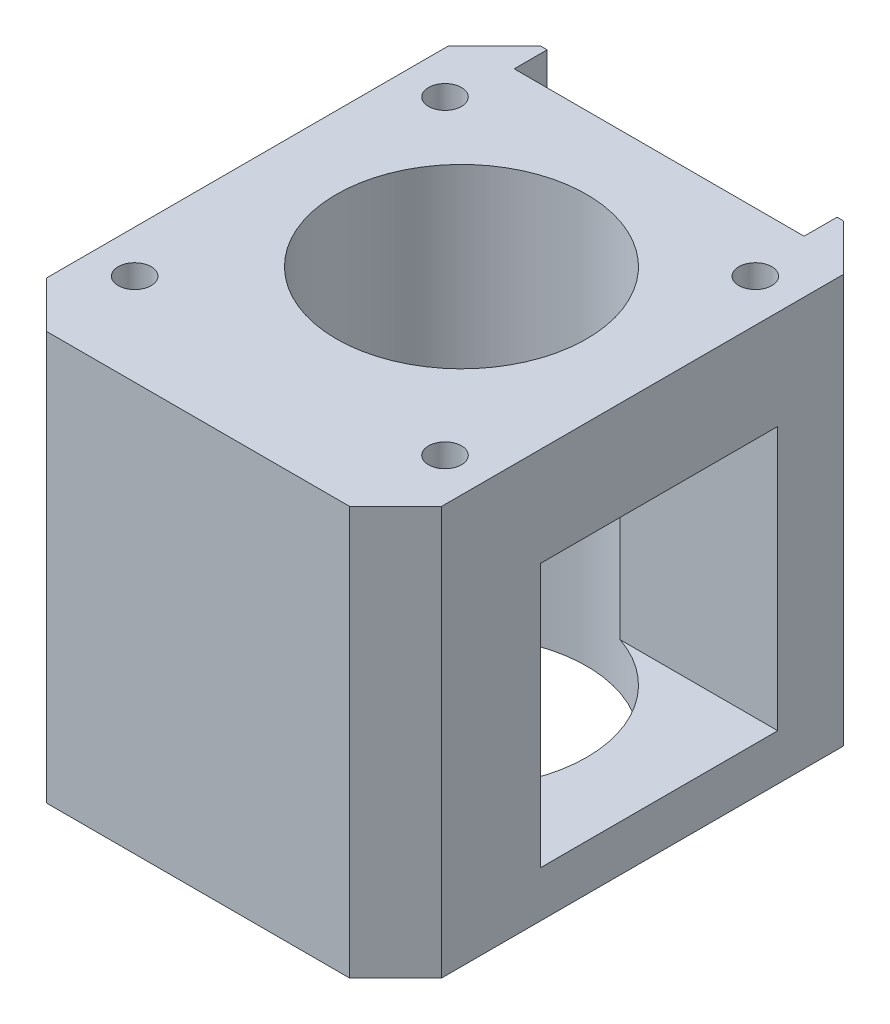
ISO-10303-21;
HEADER;
FILE_DESCRIPTION(('STEP AP214'),'2;1');
FILE_NAME('part.step','',(''),(''),'','','');
FILE_SCHEMA(('AUTOMOTIVE_DESIGN { 1 0 10303 214 1 1 1 1 }'));
ENDSEC;
DATA;
#1=APPLICATION_CONTEXT('core data for automotive mechanical design processes');
#2=APPLICATION_PROTOCOL_DEFINITION('international standard','automotive_design',2000,#1);
#3=PRODUCT_CONTEXT('',#1,'mechanical');
#4=PRODUCT('Part','Part','',(#3));
#5=PRODUCT_RELATED_PRODUCT_CATEGORY('part','',(#4));
#6=PRODUCT_DEFINITION_FORMATION('','',#4);
#7=PRODUCT_DEFINITION_CONTEXT('part definition',#1,'design');
#8=PRODUCT_DEFINITION('design','',#6,#7);
#9=PRODUCT_DEFINITION_SHAPE('','',#8);
#10=(LENGTH_UNIT() NAMED_UNIT(*) SI_UNIT(.MILLI.,.METRE.));
#11=(NAMED_UNIT(*) PLANE_ANGLE_UNIT() SI_UNIT($,.RADIAN.));
#12=(NAMED_UNIT(*) SI_UNIT($,.STERADIAN.) SOLID_ANGLE_UNIT());
#13=UNCERTAINTY_MEASURE_WITH_UNIT(LENGTH_MEASURE(1.E-05),#10,'distance_accuracy_value','');
#14=(GEOMETRIC_REPRESENTATION_CONTEXT(3) GLOBAL_UNCERTAINTY_ASSIGNED_CONTEXT((#13)) GLOBAL_UNIT_ASSIGNED_CONTEXT((#10,
#11,#12)) REPRESENTATION_CONTEXT('',''));
#15=CARTESIAN_POINT('',(0.,0.,0.));
#16=DIRECTION('',(0.,0.,1.));
#17=DIRECTION('',(1.,0.,0.));
#18=AXIS2_PLACEMENT_3D('',#15,#16,#17);
#19=CARTESIAN_POINT('',(-30.,62.,-37.5));
#20=DIRECTION('',(0.,0.,1.));
#21=DIRECTION('',(1.,0.,0.));
#22=AXIS2_PLACEMENT_3D('',#19,#20,#21);
#23=PLANE('',#22);
#24=DIRECTION('',(-1.,0.,0.));
#25=VECTOR('',#24,1.);
#26=CARTESIAN_POINT('',(-30.,0.,-37.5));
#27=LINE('',#26,#25);
#28=CARTESIAN_POINT('',(-22.,0.,-37.5));
#29=VERTEX_POINT('',#28);
#30=CARTESIAN_POINT('',(-23.,0.,-37.5));
#31=VERTEX_POINT('',#30);
#32=EDGE_CURVE('E228',#29,#31,#27,.T.);
#33=ORIENTED_EDGE('',*,*,#32,.T.);
#34=DIRECTION('',(0.,1.,0.));
#35=VECTOR('',#34,1.);
#36=CARTESIAN_POINT('',(-23.,62.,-37.5));
#37=LINE('',#36,#35);
#38=CARTESIAN_POINT('',(-23.,62.,-37.5));
#39=VERTEX_POINT('',#38);
#40=EDGE_CURVE('E260',#31,#39,#37,.T.);
#41=ORIENTED_EDGE('',*,*,#40,.T.);
#42=DIRECTION('',(-1.,0.,0.));
#43=VECTOR('',#42,1.);
#44=CARTESIAN_POINT('',(-30.,62.,-37.5));
#45=LINE('',#44,#43);
#46=CARTESIAN_POINT('',(-22.,62.,-37.5));
#47=VERTEX_POINT('',#46);
#48=EDGE_CURVE('E216',#47,#39,#45,.T.);
#49=ORIENTED_EDGE('',*,*,#48,.F.);
#50=DIRECTION('',(0.,1.,0.));
#51=VECTOR('',#50,1.);
#52=CARTESIAN_POINT('',(-22.,-53.7401153701776,-37.5));
#53=LINE('',#52,#51);
#54=EDGE_CURVE('E193',#29,#47,#53,.T.);
#55=ORIENTED_EDGE('',*,*,#54,.F.);
#56=EDGE_LOOP('',(#33,#41,#49,#55));
#57=FACE_BOUND('',#56,.T.);
#58=ADVANCED_FACE('F35',(#57),#23,.F.);
#59=CARTESIAN_POINT('',(30.,62.,-37.5));
#60=DIRECTION('',(-1.,0.,0.));
#61=DIRECTION('',(0.,0.,1.));
#62=AXIS2_PLACEMENT_3D('',#59,#60,#61);
#63=PLANE('',#62);
#64=DIRECTION('',(0.,0.,-1.));
#65=VECTOR('',#64,1.);
#66=CARTESIAN_POINT('',(30.,7.,15.5));
#67=LINE('',#66,#65);
#68=CARTESIAN_POINT('',(30.,7.,15.5));
#69=VERTEX_POINT('',#68);
#70=CARTESIAN_POINT('',(30.,7.,-20.5));
#71=VERTEX_POINT('',#70);
#72=EDGE_CURVE('E155',#69,#71,#67,.T.);
#73=ORIENTED_EDGE('',*,*,#72,.F.);
#74=DIRECTION('',(0.,-1.,0.));
#75=VECTOR('',#74,1.);
#76=CARTESIAN_POINT('',(30.,47.,15.5));
#77=LINE('',#76,#75);
#78=CARTESIAN_POINT('',(30.,47.,15.5));
#79=VERTEX_POINT('',#78);
#80=EDGE_CURVE('E483',#79,#69,#77,.T.);
#81=ORIENTED_EDGE('',*,*,#80,.F.);
#82=DIRECTION('',(0.,0.,1.));
#83=VECTOR('',#82,1.);
#84=CARTESIAN_POINT('',(30.,47.,15.5));
#85=LINE('',#84,#83);
#86=CARTESIAN_POINT('',(30.,47.,-20.5));
#87=VERTEX_POINT('',#86);
#88=EDGE_CURVE('E175',#87,#79,#85,.T.);
#89=ORIENTED_EDGE('',*,*,#88,.F.);
#90=DIRECTION('',(0.,1.,0.));
#91=VECTOR('',#90,1.);
#92=CARTESIAN_POINT('',(30.,47.,-20.5));
#93=LINE('',#92,#91);
#94=EDGE_CURVE('E179',#71,#87,#93,.T.);
#95=ORIENTED_EDGE('',*,*,#94,.F.);
#96=EDGE_LOOP('',(#73,#81,#89,#95));
#97=FACE_BOUND('',#96,.T.);
#98=DIRECTION('',(0.,0.,-1.));
#99=VECTOR('',#98,1.);
#100=CARTESIAN_POINT('',(30.,0.,-37.5));
#101=LINE('',#100,#99);
#102=CARTESIAN_POINT('',(30.,0.,30.5));
#103=VERTEX_POINT('',#102);
#104=CARTESIAN_POINT('',(30.,0.,-30.5));
#105=VERTEX_POINT('',#104);
#106=EDGE_CURVE('E213',#103,#105,#101,.T.);
#107=ORIENTED_EDGE('',*,*,#106,.T.);
#108=DIRECTION('',(0.,1.,0.));
#109=VECTOR('',#108,1.);
#110=CARTESIAN_POINT('',(30.,62.,-30.5));
#111=LINE('',#110,#109);
#112=CARTESIAN_POINT('',(30.,62.,-30.5));
#113=VERTEX_POINT('',#112);
#114=EDGE_CURVE('E11',#105,#113,#111,.T.);
#115=ORIENTED_EDGE('',*,*,#114,.T.);
#116=DIRECTION('',(0.,0.,-1.));
#117=VECTOR('',#116,1.);
#118=CARTESIAN_POINT('',(30.,62.,-37.5));
#119=LINE('',#118,#117);
#120=CARTESIAN_POINT('',(30.,62.,30.5));
#121=VERTEX_POINT('',#120);
#122=EDGE_CURVE('E214',#121,#113,#119,.T.);
#123=ORIENTED_EDGE('',*,*,#122,.F.);
#124=DIRECTION('',(0.,-1.,0.));
#125=VECTOR('',#124,1.);
#126=CARTESIAN_POINT('',(30.,62.,30.5));
#127=LINE('',#126,#125);
#128=EDGE_CURVE('E43',#121,#103,#127,.T.);
#129=ORIENTED_EDGE('',*,*,#128,.T.);
#130=EDGE_LOOP('',(#107,#115,#123,#129));
#131=FACE_BOUND('',#130,.T.);
#132=ADVANCED_FACE('F267',(#97,#131),#63,.F.);
#133=CARTESIAN_POINT('',(23.,62.,-37.5));
#134=VERTEX_POINT('',#133);
#135=CARTESIAN_POINT('',(22.,62.,-37.5));
#136=VERTEX_POINT('',#135);
#137=EDGE_CURVE('E218',#134,#136,#45,.T.);
#138=ORIENTED_EDGE('',*,*,#137,.F.);
#139=DIRECTION('',(0.,-1.,0.));
#140=VECTOR('',#139,1.);
#141=CARTESIAN_POINT('',(23.,62.,-37.5));
#142=LINE('',#141,#140);
#143=CARTESIAN_POINT('',(23.,0.,-37.5));
#144=VERTEX_POINT('',#143);
#145=EDGE_CURVE('E262',#134,#144,#142,.T.);
#146=ORIENTED_EDGE('',*,*,#145,.T.);
#147=CARTESIAN_POINT('',(22.,0.,-37.5));
#148=VERTEX_POINT('',#147);
#149=EDGE_CURVE('E229',#144,#148,#27,.T.);
#150=ORIENTED_EDGE('',*,*,#149,.T.);
#151=DIRECTION('',(0.,1.,0.));
#152=VECTOR('',#151,1.);
#153=CARTESIAN_POINT('',(22.,-53.7401153701776,-37.5));
#154=LINE('',#153,#152);
#155=EDGE_CURVE('E206',#148,#136,#154,.T.);
#156=ORIENTED_EDGE('',*,*,#155,.T.);
#157=EDGE_LOOP('',(#138,#146,#150,#156));
#158=FACE_BOUND('',#157,.T.);
#159=ADVANCED_FACE('F279',(#158),#23,.F.);
#160=CARTESIAN_POINT('',(-30.,62.,-37.5));
#161=DIRECTION('',(1.,0.,0.));
#162=DIRECTION('',(0.,0.,-1.));
#163=AXIS2_PLACEMENT_3D('',#160,#161,#162);
#164=PLANE('',#163);
#165=DIRECTION('',(0.,0.,1.));
#166=VECTOR('',#165,1.);
#167=CARTESIAN_POINT('',(-30.,0.,-37.5));
#168=LINE('',#167,#166);
#169=CARTESIAN_POINT('',(-30.,0.,-30.5));
#170=VERTEX_POINT('',#169);
#171=CARTESIAN_POINT('',(-30.,0.,30.5));
#172=VERTEX_POINT('',#171);
#173=EDGE_CURVE('E231',#170,#172,#168,.T.);
#174=ORIENTED_EDGE('',*,*,#173,.T.);
#175=DIRECTION('',(0.,1.,0.));
#176=VECTOR('',#175,1.);
#177=CARTESIAN_POINT('',(-30.,62.,30.5));
#178=LINE('',#177,#176);
#179=CARTESIAN_POINT('',(-30.,62.,30.4999999999999));
#180=VERTEX_POINT('',#179);
#181=EDGE_CURVE('E251',#172,#180,#178,.T.);
#182=ORIENTED_EDGE('',*,*,#181,.T.);
#183=DIRECTION('',(0.,0.,1.));
#184=VECTOR('',#183,1.);
#185=CARTESIAN_POINT('',(-30.,62.,-37.5));
#186=LINE('',#185,#184);
#187=CARTESIAN_POINT('',(-30.,62.,-30.5));
#188=VERTEX_POINT('',#187);
#189=EDGE_CURVE('E220',#188,#180,#186,.T.);
#190=ORIENTED_EDGE('',*,*,#189,.F.);
#191=DIRECTION('',(0.,-1.,0.));
#192=VECTOR('',#191,1.);
#193=CARTESIAN_POINT('',(-30.,62.,-30.5));
#194=LINE('',#193,#192);
#195=EDGE_CURVE('E248',#188,#170,#194,.T.);
#196=ORIENTED_EDGE('',*,*,#195,.T.);
#197=EDGE_LOOP('',(#174,#182,#190,#196));
#198=FACE_BOUND('',#197,.T.);
#199=ADVANCED_FACE('F306',(#198),#164,.F.);
#200=CARTESIAN_POINT('',(-30.,62.,37.5));
#201=DIRECTION('',(0.,0.,-1.));
#202=DIRECTION('',(-1.,0.,0.));
#203=AXIS2_PLACEMENT_3D('',#200,#201,#202);
#204=PLANE('',#203);
#205=DIRECTION('',(1.,0.,0.));
#206=VECTOR('',#205,1.);
#207=CARTESIAN_POINT('',(-30.,62.,37.5));
#208=LINE('',#207,#206);
#209=CARTESIAN_POINT('',(-23.,62.,37.5));
#210=VERTEX_POINT('',#209);
#211=CARTESIAN_POINT('',(23.,62.,37.5));
#212=VERTEX_POINT('',#211);
#213=EDGE_CURVE('E223',#210,#212,#208,.T.);
#214=ORIENTED_EDGE('',*,*,#213,.F.);
#215=DIRECTION('',(0.,-1.,0.));
#216=VECTOR('',#215,1.);
#217=CARTESIAN_POINT('',(-23.,62.,37.5));
#218=LINE('',#217,#216);
#219=CARTESIAN_POINT('',(-23.,0.,37.5));
#220=VERTEX_POINT('',#219);
#221=EDGE_CURVE('E237',#210,#220,#218,.T.);
#222=ORIENTED_EDGE('',*,*,#221,.T.);
#223=DIRECTION('',(1.,0.,0.));
#224=VECTOR('',#223,1.);
#225=CARTESIAN_POINT('',(-30.,0.,37.5));
#226=LINE('',#225,#224);
#227=CARTESIAN_POINT('',(23.,0.,37.5));
#228=VERTEX_POINT('',#227);
#229=EDGE_CURVE('E217',#220,#228,#226,.T.);
#230=ORIENTED_EDGE('',*,*,#229,.T.);
#231=DIRECTION('',(0.,1.,0.));
#232=VECTOR('',#231,1.);
#233=CARTESIAN_POINT('',(23.,62.,37.5));
#234=LINE('',#233,#232);
#235=EDGE_CURVE('E226',#228,#212,#234,.T.);
#236=ORIENTED_EDGE('',*,*,#235,.T.);
#237=EDGE_LOOP('',(#214,#222,#230,#236));
#238=FACE_BOUND('',#237,.T.);
#239=ADVANCED_FACE('F314',(#238),#204,.F.);
#240=CARTESIAN_POINT('',(0.,62.,0.));
#241=DIRECTION('',(0.,1.,0.));
#242=DIRECTION('',(0.,0.,1.));
#243=AXIS2_PLACEMENT_3D('',#240,#241,#242);
#244=PLANE('',#243);
#245=CARTESIAN_POINT('',(-23.5499999999987,62.,23.55));
#246=DIRECTION('',(0.,1.,0.));
#247=DIRECTION('',(0.,0.,1.));
#248=AXIS2_PLACEMENT_3D('',#245,#246,#247);
#249=CIRCLE('',#248,2.5000000000007);
#250=CARTESIAN_POINT('',(-23.5499999999987,62.,26.0500000000007));
#251=VERTEX_POINT('',#250);
#252=EDGE_CURVE('E434',#251,#251,#249,.T.);
#253=ORIENTED_EDGE('',*,*,#252,.F.);
#254=EDGE_LOOP('',(#253));
#255=FACE_BOUND('',#254,.T.);
#256=CARTESIAN_POINT('',(23.5500000000013,62.,23.5499999999987));
#257=DIRECTION('',(0.,1.,0.));
#258=DIRECTION('',(0.,0.,1.));
#259=AXIS2_PLACEMENT_3D('',#256,#257,#258);
#260=CIRCLE('',#259,2.50000000000187);
#261=CARTESIAN_POINT('',(23.5500000000013,62.,26.0500000000005));
#262=VERTEX_POINT('',#261);
#263=EDGE_CURVE('E433',#262,#262,#260,.T.);
#264=ORIENTED_EDGE('',*,*,#263,.F.);
#265=EDGE_LOOP('',(#264));
#266=FACE_BOUND('',#265,.T.);
#267=CARTESIAN_POINT('',(23.55,62.,-23.5500000000013));
#268=DIRECTION('',(0.,1.,0.));
#269=DIRECTION('',(0.,0.,1.));
#270=AXIS2_PLACEMENT_3D('',#267,#268,#269);
#271=CIRCLE('',#270,2.50000000000137);
#272=CARTESIAN_POINT('',(23.55,62.,-21.05));
#273=VERTEX_POINT('',#272);
#274=EDGE_CURVE('E443',#273,#273,#271,.T.);
#275=ORIENTED_EDGE('',*,*,#274,.F.);
#276=EDGE_LOOP('',(#275));
#277=FACE_BOUND('',#276,.T.);
#278=CARTESIAN_POINT('',(-23.55,62.,-23.55));
#279=DIRECTION('',(0.,1.,0.));
#280=DIRECTION('',(0.,0.,1.));
#281=AXIS2_PLACEMENT_3D('',#278,#279,#280);
#282=CIRCLE('',#281,2.5);
#283=CARTESIAN_POINT('',(-23.55,62.,-21.05));
#284=VERTEX_POINT('',#283);
#285=EDGE_CURVE('E448',#284,#284,#282,.T.);
#286=ORIENTED_EDGE('',*,*,#285,.F.);
#287=EDGE_LOOP('',(#286));
#288=FACE_BOUND('',#287,.T.);
#289=CARTESIAN_POINT('',(0.,62.,-2.5));
#290=DIRECTION('',(0.,1.,0.));
#291=DIRECTION('',(0.,0.,1.));
#292=AXIS2_PLACEMENT_3D('',#289,#290,#291);
#293=CIRCLE('',#292,19.);
#294=CARTESIAN_POINT('',(0.,62.,16.5));
#295=VERTEX_POINT('',#294);
#296=EDGE_CURVE('E168',#295,#295,#293,.T.);
#297=ORIENTED_EDGE('',*,*,#296,.F.);
#298=EDGE_LOOP('',(#297));
#299=FACE_BOUND('',#298,.T.);
#300=ORIENTED_EDGE('',*,*,#189,.T.);
#301=DIRECTION('',(-0.707106781186546,0.,-0.707106781186549));
#302=VECTOR('',#301,1.);
#303=CARTESIAN_POINT('',(-30.25,62.,30.2499999999999));
#304=LINE('',#303,#302);
#305=EDGE_CURVE('E258',#180,#210,#304,.F.);
#306=ORIENTED_EDGE('',*,*,#305,.T.);
#307=ORIENTED_EDGE('',*,*,#213,.T.);
#308=DIRECTION('',(-0.707106781186549,0.,0.707106781186546));
#309=VECTOR('',#308,1.);
#310=CARTESIAN_POINT('',(30.25,62.,30.2500000000001));
#311=LINE('',#310,#309);
#312=EDGE_CURVE('E253',#212,#121,#311,.F.);
#313=ORIENTED_EDGE('',*,*,#312,.T.);
#314=ORIENTED_EDGE('',*,*,#122,.T.);
#315=DIRECTION('',(0.707106781186546,0.,0.707106781186549));
#316=VECTOR('',#315,1.);
#317=CARTESIAN_POINT('',(30.25,62.,-30.2499999999999));
#318=LINE('',#317,#316);
#319=EDGE_CURVE('E50',#113,#134,#318,.F.);
#320=ORIENTED_EDGE('',*,*,#319,.T.);
#321=ORIENTED_EDGE('',*,*,#137,.T.);
#322=DIRECTION('',(0.,0.,-1.));
#323=VECTOR('',#322,1.);
#324=CARTESIAN_POINT('',(22.,62.,-37.5));
#325=LINE('',#324,#323);
#326=CARTESIAN_POINT('',(22.,62.,-32.5));
#327=VERTEX_POINT('',#326);
#328=EDGE_CURVE('E201',#327,#136,#325,.T.);
#329=ORIENTED_EDGE('',*,*,#328,.F.);
#330=DIRECTION('',(1.,0.,0.));
#331=VECTOR('',#330,1.);
#332=CARTESIAN_POINT('',(-22.,62.,-32.5));
#333=LINE('',#332,#331);
#334=CARTESIAN_POINT('',(-22.,62.,-32.5));
#335=VERTEX_POINT('',#334);
#336=EDGE_CURVE('E198',#335,#327,#333,.T.);
#337=ORIENTED_EDGE('',*,*,#336,.F.);
#338=DIRECTION('',(0.,0.,1.));
#339=VECTOR('',#338,1.);
#340=CARTESIAN_POINT('',(-22.,62.,-37.5));
#341=LINE('',#340,#339);
#342=EDGE_CURVE('E188',#47,#335,#341,.T.);
#343=ORIENTED_EDGE('',*,*,#342,.F.);
#344=ORIENTED_EDGE('',*,*,#48,.T.);
#345=DIRECTION('',(0.707106781186549,0.,-0.707106781186546));
#346=VECTOR('',#345,1.);
#347=CARTESIAN_POINT('',(-30.25,62.,-30.2500000000001));
#348=LINE('',#347,#346);
#349=EDGE_CURVE('E256',#39,#188,#348,.F.);
#350=ORIENTED_EDGE('',*,*,#349,.T.);
#351=EDGE_LOOP('',(#300,#306,#307,#313,#314,#320,#321,#329,#337,#343,#344,#350));
#352=FACE_BOUND('',#351,.T.);
#353=ADVANCED_FACE('F282',(#255,#266,#277,#288,#299,#352),#244,.T.);
#354=CARTESIAN_POINT('',(0.,0.,0.));
#355=DIRECTION('',(0.,1.,0.));
#356=DIRECTION('',(0.,0.,1.));
#357=AXIS2_PLACEMENT_3D('',#354,#355,#356);
#358=PLANE('',#357);
#359=CARTESIAN_POINT('',(0.,0.,-2.5));
#360=DIRECTION('',(0.,1.,0.));
#361=DIRECTION('',(0.,0.,1.));
#362=AXIS2_PLACEMENT_3D('',#359,#360,#361);
#363=CIRCLE('',#362,19.);
#364=CARTESIAN_POINT('',(0.,0.,16.5));
#365=VERTEX_POINT('',#364);
#366=EDGE_CURVE('E185',#365,#365,#363,.F.);
#367=ORIENTED_EDGE('',*,*,#366,.F.);
#368=EDGE_LOOP('',(#367));
#369=FACE_BOUND('',#368,.T.);
#370=ORIENTED_EDGE('',*,*,#229,.F.);
#371=DIRECTION('',(0.707106781186546,0.,0.707106781186549));
#372=VECTOR('',#371,1.);
#373=CARTESIAN_POINT('',(-23.,0.,37.5));
#374=LINE('',#373,#372);
#375=EDGE_CURVE('E246',#220,#172,#374,.F.);
#376=ORIENTED_EDGE('',*,*,#375,.T.);
#377=ORIENTED_EDGE('',*,*,#173,.F.);
#378=DIRECTION('',(-0.707106781186549,0.,0.707106781186546));
#379=VECTOR('',#378,1.);
#380=CARTESIAN_POINT('',(-30.,0.,-30.5));
#381=LINE('',#380,#379);
#382=EDGE_CURVE('E244',#170,#31,#381,.F.);
#383=ORIENTED_EDGE('',*,*,#382,.T.);
#384=ORIENTED_EDGE('',*,*,#32,.F.);
#385=DIRECTION('',(0.,0.,-1.));
#386=VECTOR('',#385,1.);
#387=CARTESIAN_POINT('',(-22.,0.,-37.5));
#388=LINE('',#387,#386);
#389=CARTESIAN_POINT('',(-22.,0.,-32.5));
#390=VERTEX_POINT('',#389);
#391=EDGE_CURVE('E192',#390,#29,#388,.T.);
#392=ORIENTED_EDGE('',*,*,#391,.F.);
#393=DIRECTION('',(-1.,0.,0.));
#394=VECTOR('',#393,1.);
#395=CARTESIAN_POINT('',(-22.,0.,-32.5));
#396=LINE('',#395,#394);
#397=CARTESIAN_POINT('',(22.,0.,-32.5));
#398=VERTEX_POINT('',#397);
#399=EDGE_CURVE('E195',#398,#390,#396,.T.);
#400=ORIENTED_EDGE('',*,*,#399,.F.);
#401=DIRECTION('',(0.,0.,1.));
#402=VECTOR('',#401,1.);
#403=CARTESIAN_POINT('',(22.,0.,-37.5));
#404=LINE('',#403,#402);
#405=EDGE_CURVE('E189',#148,#398,#404,.T.);
#406=ORIENTED_EDGE('',*,*,#405,.F.);
#407=ORIENTED_EDGE('',*,*,#149,.F.);
#408=DIRECTION('',(-0.707106781186546,0.,-0.707106781186549));
#409=VECTOR('',#408,1.);
#410=CARTESIAN_POINT('',(23.,0.,-37.5));
#411=LINE('',#410,#409);
#412=EDGE_CURVE('E242',#144,#105,#411,.F.);
#413=ORIENTED_EDGE('',*,*,#412,.T.);
#414=ORIENTED_EDGE('',*,*,#106,.F.);
#415=DIRECTION('',(0.707106781186549,0.,-0.707106781186546));
#416=VECTOR('',#415,1.);
#417=CARTESIAN_POINT('',(30.,0.,30.5));
#418=LINE('',#417,#416);
#419=EDGE_CURVE('E240',#103,#228,#418,.F.);
#420=ORIENTED_EDGE('',*,*,#419,.T.);
#421=EDGE_LOOP('',(#370,#376,#377,#383,#384,#392,#400,#406,#407,#413,#414,#420));
#422=FACE_BOUND('',#421,.T.);
#423=ADVANCED_FACE('F272',(#369,#422),#358,.F.);
#424=CARTESIAN_POINT('',(-22.,-53.7401153701776,-37.5));
#425=DIRECTION('',(-1.,0.,0.));
#426=DIRECTION('',(0.,0.,1.));
#427=AXIS2_PLACEMENT_3D('',#424,#425,#426);
#428=PLANE('',#427);
#429=ORIENTED_EDGE('',*,*,#391,.T.);
#430=ORIENTED_EDGE('',*,*,#54,.T.);
#431=ORIENTED_EDGE('',*,*,#342,.T.);
#432=DIRECTION('',(0.,1.,0.));
#433=VECTOR('',#432,1.);
#434=CARTESIAN_POINT('',(-22.,-53.7401153701776,-32.5));
#435=LINE('',#434,#433);
#436=EDGE_CURVE('E204',#390,#335,#435,.T.);
#437=ORIENTED_EDGE('',*,*,#436,.F.);
#438=EDGE_LOOP('',(#429,#430,#431,#437));
#439=FACE_BOUND('',#438,.T.);
#440=ADVANCED_FACE('F344',(#439),#428,.F.);
#441=CARTESIAN_POINT('',(22.,-53.7401153701776,-37.5));
#442=DIRECTION('',(1.,0.,0.));
#443=DIRECTION('',(0.,0.,-1.));
#444=AXIS2_PLACEMENT_3D('',#441,#442,#443);
#445=PLANE('',#444);
#446=ORIENTED_EDGE('',*,*,#405,.T.);
#447=DIRECTION('',(0.,1.,0.));
#448=VECTOR('',#447,1.);
#449=CARTESIAN_POINT('',(22.,-53.7401153701776,-32.5));
#450=LINE('',#449,#448);
#451=EDGE_CURVE('E209',#398,#327,#450,.T.);
#452=ORIENTED_EDGE('',*,*,#451,.T.);
#453=ORIENTED_EDGE('',*,*,#328,.T.);
#454=ORIENTED_EDGE('',*,*,#155,.F.);
#455=EDGE_LOOP('',(#446,#452,#453,#454));
#456=FACE_BOUND('',#455,.T.);
#457=ADVANCED_FACE('F285',(#456),#445,.F.);
#458=CARTESIAN_POINT('',(-22.,-53.7401153701776,-32.5));
#459=DIRECTION('',(0.,0.,1.));
#460=DIRECTION('',(1.,0.,0.));
#461=AXIS2_PLACEMENT_3D('',#458,#459,#460);
#462=PLANE('',#461);
#463=CARTESIAN_POINT('',(-14.0000000000005,9.,-32.5));
#464=DIRECTION('',(0.,0.,-1.));
#465=DIRECTION('',(-1.,0.,0.));
#466=AXIS2_PLACEMENT_3D('',#463,#464,#465);
#467=CIRCLE('',#466,2.5);
#468=CARTESIAN_POINT('',(-16.5000000000005,9.,-32.5));
#469=VERTEX_POINT('',#468);
#470=EDGE_CURVE('E454',#469,#469,#467,.T.);
#471=ORIENTED_EDGE('',*,*,#470,.F.);
#472=EDGE_LOOP('',(#471));
#473=FACE_BOUND('',#472,.T.);
#474=CARTESIAN_POINT('',(13.9999999999995,9.,-32.5));
#475=DIRECTION('',(0.,0.,-1.));
#476=DIRECTION('',(-1.,0.,0.));
#477=AXIS2_PLACEMENT_3D('',#474,#475,#476);
#478=CIRCLE('',#477,2.5);
#479=CARTESIAN_POINT('',(11.4999999999995,9.,-32.5));
#480=VERTEX_POINT('',#479);
#481=EDGE_CURVE('E460',#480,#480,#478,.T.);
#482=ORIENTED_EDGE('',*,*,#481,.F.);
#483=EDGE_LOOP('',(#482));
#484=FACE_BOUND('',#483,.T.);
#485=CARTESIAN_POINT('',(-14.,53.,-32.5));
#486=DIRECTION('',(0.,0.,-1.));
#487=DIRECTION('',(-1.,0.,0.));
#488=AXIS2_PLACEMENT_3D('',#485,#486,#487);
#489=CIRCLE('',#488,2.5);
#490=CARTESIAN_POINT('',(-16.5,53.,-32.5));
#491=VERTEX_POINT('',#490);
#492=EDGE_CURVE('E466',#491,#491,#489,.T.);
#493=ORIENTED_EDGE('',*,*,#492,.F.);
#494=EDGE_LOOP('',(#493));
#495=FACE_BOUND('',#494,.T.);
#496=CARTESIAN_POINT('',(14.,53.,-32.5));
#497=DIRECTION('',(0.,0.,-1.));
#498=DIRECTION('',(-1.,0.,0.));
#499=AXIS2_PLACEMENT_3D('',#496,#497,#498);
#500=CIRCLE('',#499,2.5);
#501=CARTESIAN_POINT('',(11.5,53.,-32.5));
#502=VERTEX_POINT('',#501);
#503=EDGE_CURVE('E472',#502,#502,#500,.T.);
#504=ORIENTED_EDGE('',*,*,#503,.F.);
#505=EDGE_LOOP('',(#504));
#506=FACE_BOUND('',#505,.T.);
#507=ORIENTED_EDGE('',*,*,#399,.T.);
#508=ORIENTED_EDGE('',*,*,#436,.T.);
#509=ORIENTED_EDGE('',*,*,#336,.T.);
#510=ORIENTED_EDGE('',*,*,#451,.F.);
#511=EDGE_LOOP('',(#507,#508,#509,#510));
#512=FACE_BOUND('',#511,.T.);
#513=ADVANCED_FACE('F288',(#473,#484,#495,#506,#512),#462,.F.);
#514=CARTESIAN_POINT('',(0.,-53.7401153701776,-2.5));
#515=DIRECTION('',(0.,1.,0.));
#516=DIRECTION('',(0.,0.,1.));
#517=AXIS2_PLACEMENT_3D('',#514,#515,#516);
#518=CYLINDRICAL_SURFACE('',#517,19.);
#519=CARTESIAN_POINT('',(0.,47.,-2.5));
#520=DIRECTION('',(0.,1.,0.));
#521=DIRECTION('',(0.,0.,1.));
#522=AXIS2_PLACEMENT_3D('',#519,#520,#521);
#523=CIRCLE('',#522,19.);
#524=CARTESIAN_POINT('',(6.08276253029819,47.,15.5));
#525=VERTEX_POINT('',#524);
#526=CARTESIAN_POINT('',(6.08276253029821,47.,-20.5));
#527=VERTEX_POINT('',#526);
#528=EDGE_CURVE('E169',#525,#527,#523,.T.);
#529=ORIENTED_EDGE('',*,*,#528,.F.);
#530=DIRECTION('',(0.,1.,0.));
#531=VECTOR('',#530,1.);
#532=CARTESIAN_POINT('',(6.08276253029823,-53.7401153701776,15.5));
#533=LINE('',#532,#531);
#534=CARTESIAN_POINT('',(6.08276253029822,7.,15.5));
#535=VERTEX_POINT('',#534);
#536=EDGE_CURVE('E174',#535,#525,#533,.T.);
#537=ORIENTED_EDGE('',*,*,#536,.F.);
#538=CARTESIAN_POINT('',(0.,7.,-2.5));
#539=DIRECTION('',(0.,-1.,0.));
#540=DIRECTION('',(0.,0.,-1.));
#541=AXIS2_PLACEMENT_3D('',#538,#539,#540);
#542=CIRCLE('',#541,19.);
#543=CARTESIAN_POINT('',(6.08276253029823,7.,-20.5));
#544=VERTEX_POINT('',#543);
#545=EDGE_CURVE('E152',#544,#535,#542,.T.);
#546=ORIENTED_EDGE('',*,*,#545,.F.);
#547=DIRECTION('',(0.,1.,0.));
#548=VECTOR('',#547,1.);
#549=CARTESIAN_POINT('',(6.08276253029821,-53.7401153701776,-20.5));
#550=LINE('',#549,#548);
#551=EDGE_CURVE('E164',#527,#544,#550,.F.);
#552=ORIENTED_EDGE('',*,*,#551,.F.);
#553=EDGE_LOOP('',(#529,#537,#546,#552));
#554=FACE_BOUND('',#553,.T.);
#555=ORIENTED_EDGE('',*,*,#366,.T.);
#556=EDGE_LOOP('',(#555));
#557=FACE_BOUND('',#556,.T.);
#558=ORIENTED_EDGE('',*,*,#296,.T.);
#559=EDGE_LOOP('',(#558));
#560=FACE_BOUND('',#559,.T.);
#561=ADVANCED_FACE('F171',(#554,#557,#560),#518,.F.);
#562=CARTESIAN_POINT('',(-30.001,47.,15.5));
#563=DIRECTION('',(0.,0.,1.));
#564=DIRECTION('',(1.,0.,0.));
#565=AXIS2_PLACEMENT_3D('',#562,#563,#564);
#566=PLANE('',#565);
#567=ORIENTED_EDGE('',*,*,#536,.T.);
#568=DIRECTION('',(1.,0.,0.));
#569=VECTOR('',#568,1.);
#570=CARTESIAN_POINT('',(-30.001,47.,15.5));
#571=LINE('',#570,#569);
#572=EDGE_CURVE('E160',#525,#79,#571,.T.);
#573=ORIENTED_EDGE('',*,*,#572,.T.);
#574=ORIENTED_EDGE('',*,*,#80,.T.);
#575=DIRECTION('',(1.,0.,0.));
#576=VECTOR('',#575,1.);
#577=CARTESIAN_POINT('',(-30.001,7.,15.5));
#578=LINE('',#577,#576);
#579=EDGE_CURVE('E478',#535,#69,#578,.T.);
#580=ORIENTED_EDGE('',*,*,#579,.F.);
#581=EDGE_LOOP('',(#567,#573,#574,#580));
#582=FACE_BOUND('',#581,.T.);
#583=ADVANCED_FACE('F358',(#582),#566,.F.);
#584=CARTESIAN_POINT('',(-30.001,47.,15.5));
#585=DIRECTION('',(0.,1.,0.));
#586=DIRECTION('',(0.,0.,1.));
#587=AXIS2_PLACEMENT_3D('',#584,#585,#586);
#588=PLANE('',#587);
#589=ORIENTED_EDGE('',*,*,#528,.T.);
#590=DIRECTION('',(1.,0.,0.));
#591=VECTOR('',#590,1.);
#592=CARTESIAN_POINT('',(-30.001,47.,-20.5));
#593=LINE('',#592,#591);
#594=EDGE_CURVE('E159',#527,#87,#593,.T.);
#595=ORIENTED_EDGE('',*,*,#594,.T.);
#596=ORIENTED_EDGE('',*,*,#88,.T.);
#597=ORIENTED_EDGE('',*,*,#572,.F.);
#598=EDGE_LOOP('',(#589,#595,#596,#597));
#599=FACE_BOUND('',#598,.T.);
#600=ADVANCED_FACE('F361',(#599),#588,.F.);
#601=CARTESIAN_POINT('',(-30.001,7.,15.5));
#602=DIRECTION('',(0.,-1.,0.));
#603=DIRECTION('',(0.,0.,-1.));
#604=AXIS2_PLACEMENT_3D('',#601,#602,#603);
#605=PLANE('',#604);
#606=ORIENTED_EDGE('',*,*,#545,.T.);
#607=ORIENTED_EDGE('',*,*,#579,.T.);
#608=ORIENTED_EDGE('',*,*,#72,.T.);
#609=DIRECTION('',(1.,0.,0.));
#610=VECTOR('',#609,1.);
#611=CARTESIAN_POINT('',(-30.001,7.,-20.5));
#612=LINE('',#611,#610);
#613=EDGE_CURVE('E148',#544,#71,#612,.T.);
#614=ORIENTED_EDGE('',*,*,#613,.F.);
#615=EDGE_LOOP('',(#606,#607,#608,#614));
#616=FACE_BOUND('',#615,.T.);
#617=ADVANCED_FACE('F150',(#616),#605,.F.);
#618=CARTESIAN_POINT('',(-30.001,47.,-20.5));
#619=DIRECTION('',(0.,0.,-1.));
#620=DIRECTION('',(-1.,0.,0.));
#621=AXIS2_PLACEMENT_3D('',#618,#619,#620);
#622=PLANE('',#621);
#623=ORIENTED_EDGE('',*,*,#551,.T.);
#624=ORIENTED_EDGE('',*,*,#613,.T.);
#625=ORIENTED_EDGE('',*,*,#94,.T.);
#626=ORIENTED_EDGE('',*,*,#594,.F.);
#627=EDGE_LOOP('',(#623,#624,#625,#626));
#628=FACE_BOUND('',#627,.T.);
#629=ADVANCED_FACE('F165',(#628),#622,.F.);
#630=CARTESIAN_POINT('',(-23.,62.,37.5));
#631=DIRECTION('',(0.707106781186549,0.,-0.707106781186546));
#632=DIRECTION('',(0.,-1.,0.));
#633=AXIS2_PLACEMENT_3D('',#630,#631,#632);
#634=PLANE('',#633);
#635=ORIENTED_EDGE('',*,*,#305,.F.);
#636=ORIENTED_EDGE('',*,*,#181,.F.);
#637=ORIENTED_EDGE('',*,*,#375,.F.);
#638=ORIENTED_EDGE('',*,*,#221,.F.);
#639=EDGE_LOOP('',(#635,#636,#637,#638));
#640=FACE_BOUND('',#639,.T.);
#641=ADVANCED_FACE('F310',(#640),#634,.F.);
#642=CARTESIAN_POINT('',(-30.,62.,-30.5));
#643=DIRECTION('',(0.707106781186546,0.,0.707106781186549));
#644=DIRECTION('',(0.,-1.,0.));
#645=AXIS2_PLACEMENT_3D('',#642,#643,#644);
#646=PLANE('',#645);
#647=ORIENTED_EDGE('',*,*,#349,.F.);
#648=ORIENTED_EDGE('',*,*,#40,.F.);
#649=ORIENTED_EDGE('',*,*,#382,.F.);
#650=ORIENTED_EDGE('',*,*,#195,.F.);
#651=EDGE_LOOP('',(#647,#648,#649,#650));
#652=FACE_BOUND('',#651,.T.);
#653=ADVANCED_FACE('F301',(#652),#646,.F.);
#654=CARTESIAN_POINT('',(23.,62.,-37.5));
#655=DIRECTION('',(-0.707106781186549,0.,0.707106781186546));
#656=DIRECTION('',(0.,-1.,0.));
#657=AXIS2_PLACEMENT_3D('',#654,#655,#656);
#658=PLANE('',#657);
#659=ORIENTED_EDGE('',*,*,#319,.F.);
#660=ORIENTED_EDGE('',*,*,#114,.F.);
#661=ORIENTED_EDGE('',*,*,#412,.F.);
#662=ORIENTED_EDGE('',*,*,#145,.F.);
#663=EDGE_LOOP('',(#659,#660,#661,#662));
#664=FACE_BOUND('',#663,.T.);
#665=ADVANCED_FACE('F277',(#664),#658,.F.);
#666=CARTESIAN_POINT('',(30.,62.,30.5));
#667=DIRECTION('',(-0.707106781186546,0.,-0.707106781186549));
#668=DIRECTION('',(0.,-1.,0.));
#669=AXIS2_PLACEMENT_3D('',#666,#667,#668);
#670=PLANE('',#669);
#671=ORIENTED_EDGE('',*,*,#312,.F.);
#672=ORIENTED_EDGE('',*,*,#235,.F.);
#673=ORIENTED_EDGE('',*,*,#419,.F.);
#674=ORIENTED_EDGE('',*,*,#128,.F.);
#675=EDGE_LOOP('',(#671,#672,#673,#674));
#676=FACE_BOUND('',#675,.T.);
#677=ADVANCED_FACE('F37',(#676),#670,.F.);
#678=CARTESIAN_POINT('',(14.,53.,-22.5));
#679=DIRECTION('',(0.,0.,-1.));
#680=DIRECTION('',(-1.,0.,0.));
#681=AXIS2_PLACEMENT_3D('',#678,#679,#680);
#682=CYLINDRICAL_SURFACE('',#681,2.5);
#683=CARTESIAN_POINT('',(14.,53.,-22.5));
#684=DIRECTION('',(0.,0.,-1.));
#685=DIRECTION('',(-1.,0.,0.));
#686=AXIS2_PLACEMENT_3D('',#683,#684,#685);
#687=CIRCLE('',#686,2.5);
#688=CARTESIAN_POINT('',(11.5,53.,-22.5));
#689=VERTEX_POINT('',#688);
#690=EDGE_CURVE('E475',#689,#689,#687,.T.);
#691=ORIENTED_EDGE('',*,*,#690,.F.);
#692=EDGE_LOOP('',(#691));
#693=FACE_BOUND('',#692,.T.);
#694=ORIENTED_EDGE('',*,*,#503,.T.);
#695=EDGE_LOOP('',(#694));
#696=FACE_BOUND('',#695,.T.);
#697=ADVANCED_FACE('F317',(#693,#696),#682,.F.);
#698=CARTESIAN_POINT('',(14.,53.,-22.5));
#699=DIRECTION('',(0.,0.,-1.));
#700=DIRECTION('',(-1.,0.,0.));
#701=AXIS2_PLACEMENT_3D('',#698,#699,#700);
#702=PLANE('',#701);
#703=ORIENTED_EDGE('',*,*,#690,.T.);
#704=EDGE_LOOP('',(#703));
#705=FACE_BOUND('',#704,.T.);
#706=ADVANCED_FACE('F322',(#705),#702,.T.);
#707=CARTESIAN_POINT('',(-14.,53.,-22.5));
#708=DIRECTION('',(0.,0.,-1.));
#709=DIRECTION('',(-1.,0.,0.));
#710=AXIS2_PLACEMENT_3D('',#707,#708,#709);
#711=CYLINDRICAL_SURFACE('',#710,2.5);
#712=CARTESIAN_POINT('',(-14.,53.,-22.5));
#713=DIRECTION('',(0.,0.,-1.));
#714=DIRECTION('',(-1.,0.,0.));
#715=AXIS2_PLACEMENT_3D('',#712,#713,#714);
#716=CIRCLE('',#715,2.5);
#717=CARTESIAN_POINT('',(-16.5,53.,-22.5));
#718=VERTEX_POINT('',#717);
#719=EDGE_CURVE('E469',#718,#718,#716,.T.);
#720=ORIENTED_EDGE('',*,*,#719,.F.);
#721=EDGE_LOOP('',(#720));
#722=FACE_BOUND('',#721,.T.);
#723=ORIENTED_EDGE('',*,*,#492,.T.);
#724=EDGE_LOOP('',(#723));
#725=FACE_BOUND('',#724,.T.);
#726=ADVANCED_FACE('F372',(#722,#725),#711,.F.);
#727=CARTESIAN_POINT('',(-14.,53.,-22.5));
#728=DIRECTION('',(0.,0.,-1.));
#729=DIRECTION('',(-1.,0.,0.));
#730=AXIS2_PLACEMENT_3D('',#727,#728,#729);
#731=PLANE('',#730);
#732=ORIENTED_EDGE('',*,*,#719,.T.);
#733=EDGE_LOOP('',(#732));
#734=FACE_BOUND('',#733,.T.);
#735=ADVANCED_FACE('F376',(#734),#731,.T.);
#736=CARTESIAN_POINT('',(13.9999999999995,9.,-22.5));
#737=DIRECTION('',(0.,0.,-1.));
#738=DIRECTION('',(-1.,0.,0.));
#739=AXIS2_PLACEMENT_3D('',#736,#737,#738);
#740=CYLINDRICAL_SURFACE('',#739,2.5);
#741=CARTESIAN_POINT('',(13.9999999999995,9.,-22.5));
#742=DIRECTION('',(0.,0.,-1.));
#743=DIRECTION('',(-1.,0.,0.));
#744=AXIS2_PLACEMENT_3D('',#741,#742,#743);
#745=CIRCLE('',#744,2.5);
#746=CARTESIAN_POINT('',(11.4999999999995,9.,-22.5));
#747=VERTEX_POINT('',#746);
#748=EDGE_CURVE('E463',#747,#747,#745,.T.);
#749=ORIENTED_EDGE('',*,*,#748,.F.);
#750=EDGE_LOOP('',(#749));
#751=FACE_BOUND('',#750,.T.);
#752=ORIENTED_EDGE('',*,*,#481,.T.);
#753=EDGE_LOOP('',(#752));
#754=FACE_BOUND('',#753,.T.);
#755=ADVANCED_FACE('F380',(#751,#754),#740,.F.);
#756=CARTESIAN_POINT('',(13.9999999999995,9.,-22.5));
#757=DIRECTION('',(0.,0.,-1.));
#758=DIRECTION('',(-1.,0.,0.));
#759=AXIS2_PLACEMENT_3D('',#756,#757,#758);
#760=PLANE('',#759);
#761=ORIENTED_EDGE('',*,*,#748,.T.);
#762=EDGE_LOOP('',(#761));
#763=FACE_BOUND('',#762,.T.);
#764=ADVANCED_FACE('F384',(#763),#760,.T.);
#765=CARTESIAN_POINT('',(-14.0000000000005,9.,-22.5));
#766=DIRECTION('',(0.,0.,-1.));
#767=DIRECTION('',(-1.,0.,0.));
#768=AXIS2_PLACEMENT_3D('',#765,#766,#767);
#769=CYLINDRICAL_SURFACE('',#768,2.5);
#770=CARTESIAN_POINT('',(-14.0000000000005,9.,-22.5));
#771=DIRECTION('',(0.,0.,-1.));
#772=DIRECTION('',(-1.,0.,0.));
#773=AXIS2_PLACEMENT_3D('',#770,#771,#772);
#774=CIRCLE('',#773,2.5);
#775=CARTESIAN_POINT('',(-16.5000000000005,9.,-22.5));
#776=VERTEX_POINT('',#775);
#777=EDGE_CURVE('E457',#776,#776,#774,.T.);
#778=ORIENTED_EDGE('',*,*,#777,.F.);
#779=EDGE_LOOP('',(#778));
#780=FACE_BOUND('',#779,.T.);
#781=ORIENTED_EDGE('',*,*,#470,.T.);
#782=EDGE_LOOP('',(#781));
#783=FACE_BOUND('',#782,.T.);
#784=ADVANCED_FACE('F388',(#780,#783),#769,.F.);
#785=CARTESIAN_POINT('',(-14.0000000000005,9.,-22.5));
#786=DIRECTION('',(0.,0.,-1.));
#787=DIRECTION('',(-1.,0.,0.));
#788=AXIS2_PLACEMENT_3D('',#785,#786,#787);
#789=PLANE('',#788);
#790=ORIENTED_EDGE('',*,*,#777,.T.);
#791=EDGE_LOOP('',(#790));
#792=FACE_BOUND('',#791,.T.);
#793=ADVANCED_FACE('F392',(#792),#789,.T.);
#794=CARTESIAN_POINT('',(-23.55,42.,-23.55));
#795=DIRECTION('',(0.,1.,0.));
#796=DIRECTION('',(0.,0.,1.));
#797=AXIS2_PLACEMENT_3D('',#794,#795,#796);
#798=CYLINDRICAL_SURFACE('',#797,2.5);
#799=CARTESIAN_POINT('',(-23.55,42.,-23.55));
#800=DIRECTION('',(0.,1.,0.));
#801=DIRECTION('',(0.,0.,1.));
#802=AXIS2_PLACEMENT_3D('',#799,#800,#801);
#803=CIRCLE('',#802,2.5);
#804=CARTESIAN_POINT('',(-23.55,42.,-21.05));
#805=VERTEX_POINT('',#804);
#806=EDGE_CURVE('E451',#805,#805,#803,.T.);
#807=ORIENTED_EDGE('',*,*,#806,.F.);
#808=EDGE_LOOP('',(#807));
#809=FACE_BOUND('',#808,.T.);
#810=ORIENTED_EDGE('',*,*,#285,.T.);
#811=EDGE_LOOP('',(#810));
#812=FACE_BOUND('',#811,.T.);
#813=ADVANCED_FACE('F396',(#809,#812),#798,.F.);
#814=CARTESIAN_POINT('',(-23.55,42.,-23.55));
#815=DIRECTION('',(0.,1.,0.));
#816=DIRECTION('',(0.,0.,1.));
#817=AXIS2_PLACEMENT_3D('',#814,#815,#816);
#818=PLANE('',#817);
#819=ORIENTED_EDGE('',*,*,#806,.T.);
#820=EDGE_LOOP('',(#819));
#821=FACE_BOUND('',#820,.T.);
#822=ADVANCED_FACE('F400',(#821),#818,.T.);
#823=CARTESIAN_POINT('',(23.55,42.,-23.5500000000013));
#824=DIRECTION('',(0.,1.,0.));
#825=DIRECTION('',(0.,0.,1.));
#826=AXIS2_PLACEMENT_3D('',#823,#824,#825);
#827=CYLINDRICAL_SURFACE('',#826,2.50000000000137);
#828=CARTESIAN_POINT('',(23.55,42.,-23.5500000000013));
#829=DIRECTION('',(0.,1.,0.));
#830=DIRECTION('',(0.,0.,1.));
#831=AXIS2_PLACEMENT_3D('',#828,#829,#830);
#832=CIRCLE('',#831,2.50000000000137);
#833=CARTESIAN_POINT('',(23.55,42.,-21.05));
#834=VERTEX_POINT('',#833);
#835=EDGE_CURVE('E445',#834,#834,#832,.T.);
#836=ORIENTED_EDGE('',*,*,#835,.F.);
#837=EDGE_LOOP('',(#836));
#838=FACE_BOUND('',#837,.T.);
#839=ORIENTED_EDGE('',*,*,#274,.T.);
#840=EDGE_LOOP('',(#839));
#841=FACE_BOUND('',#840,.T.);
#842=ADVANCED_FACE('F404',(#838,#841),#827,.F.);
#843=CARTESIAN_POINT('',(23.55,42.,-23.5500000000013));
#844=DIRECTION('',(0.,1.,0.));
#845=DIRECTION('',(0.,0.,1.));
#846=AXIS2_PLACEMENT_3D('',#843,#844,#845);
#847=PLANE('',#846);
#848=ORIENTED_EDGE('',*,*,#835,.T.);
#849=EDGE_LOOP('',(#848));
#850=FACE_BOUND('',#849,.T.);
#851=ADVANCED_FACE('F408',(#850),#847,.T.);
#852=CARTESIAN_POINT('',(23.5500000000013,42.,23.5499999999987));
#853=DIRECTION('',(0.,1.,0.));
#854=DIRECTION('',(0.,0.,1.));
#855=AXIS2_PLACEMENT_3D('',#852,#853,#854);
#856=CYLINDRICAL_SURFACE('',#855,2.50000000000187);
#857=CARTESIAN_POINT('',(23.5500000000013,42.,23.5499999999987));
#858=DIRECTION('',(0.,1.,0.));
#859=DIRECTION('',(0.,0.,1.));
#860=AXIS2_PLACEMENT_3D('',#857,#858,#859);
#861=CIRCLE('',#860,2.50000000000187);
#862=CARTESIAN_POINT('',(23.5500000000013,42.,26.0500000000005));
#863=VERTEX_POINT('',#862);
#864=EDGE_CURVE('E437',#863,#863,#861,.T.);
#865=ORIENTED_EDGE('',*,*,#864,.F.);
#866=EDGE_LOOP('',(#865));
#867=FACE_BOUND('',#866,.T.);
#868=ORIENTED_EDGE('',*,*,#263,.T.);
#869=EDGE_LOOP('',(#868));
#870=FACE_BOUND('',#869,.T.);
#871=ADVANCED_FACE('F412',(#867,#870),#856,.F.);
#872=CARTESIAN_POINT('',(23.5500000000013,42.,23.5499999999987));
#873=DIRECTION('',(0.,1.,0.));
#874=DIRECTION('',(0.,0.,1.));
#875=AXIS2_PLACEMENT_3D('',#872,#873,#874);
#876=PLANE('',#875);
#877=ORIENTED_EDGE('',*,*,#864,.T.);
#878=EDGE_LOOP('',(#877));
#879=FACE_BOUND('',#878,.T.);
#880=ADVANCED_FACE('F416',(#879),#876,.T.);
#881=CARTESIAN_POINT('',(-23.5499999999987,42.,23.55));
#882=DIRECTION('',(0.,1.,0.));
#883=DIRECTION('',(0.,0.,1.));
#884=AXIS2_PLACEMENT_3D('',#881,#882,#883);
#885=CYLINDRICAL_SURFACE('',#884,2.5000000000007);
#886=CARTESIAN_POINT('',(-23.5499999999987,42.,23.55));
#887=DIRECTION('',(0.,1.,0.));
#888=DIRECTION('',(0.,0.,1.));
#889=AXIS2_PLACEMENT_3D('',#886,#887,#888);
#890=CIRCLE('',#889,2.5000000000007);
#891=CARTESIAN_POINT('',(-23.5499999999987,42.,26.0500000000007));
#892=VERTEX_POINT('',#891);
#893=EDGE_CURVE('E432',#892,#892,#890,.T.);
#894=ORIENTED_EDGE('',*,*,#893,.F.);
#895=EDGE_LOOP('',(#894));
#896=FACE_BOUND('',#895,.T.);
#897=ORIENTED_EDGE('',*,*,#252,.T.);
#898=EDGE_LOOP('',(#897));
#899=FACE_BOUND('',#898,.T.);
#900=ADVANCED_FACE('F420',(#896,#899),#885,.F.);
#901=CARTESIAN_POINT('',(-23.5499999999987,42.,23.55));
#902=DIRECTION('',(0.,1.,0.));
#903=DIRECTION('',(0.,0.,1.));
#904=AXIS2_PLACEMENT_3D('',#901,#902,#903);
#905=PLANE('',#904);
#906=ORIENTED_EDGE('',*,*,#893,.T.);
#907=EDGE_LOOP('',(#906));
#908=FACE_BOUND('',#907,.T.);
#909=ADVANCED_FACE('F424',(#908),#905,.T.);
#910=CLOSED_SHELL('',(#58,#132,#159,#199,#239,#353,#423,#440,#457,#513,#561,#583,#600,#617,#629,
#641,#653,#665,#677,#697,#706,#726,#735,#755,#764,#784,#793,#813,#822,#842,#851,#871,#880,#900,#909));
#911=MANIFOLD_SOLID_BREP('B2',#910);
#912=ADVANCED_BREP_SHAPE_REPRESENTATION('',(#18,#911),#14);
#913=SHAPE_DEFINITION_REPRESENTATION(#9,#912);
ENDSEC;
END-ISO-10303-21;
